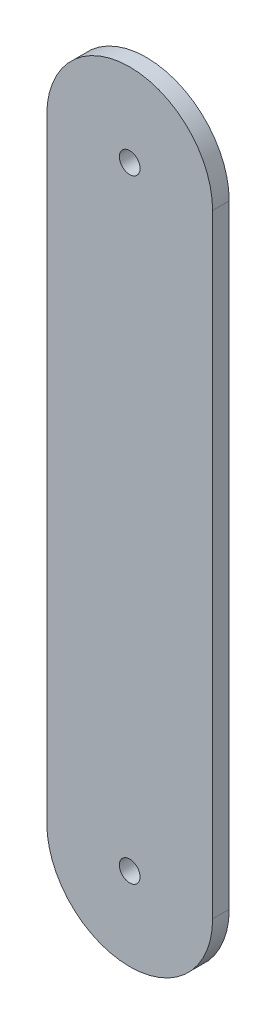
ISO-10303-21;
HEADER;
FILE_DESCRIPTION(('STEP AP214'),'2;1');
FILE_NAME('part.step','',(''),(''),'','','');
FILE_SCHEMA(('AUTOMOTIVE_DESIGN { 1 0 10303 214 1 1 1 1 }'));
ENDSEC;
DATA;
#1=APPLICATION_CONTEXT('core data for automotive mechanical design processes');
#2=APPLICATION_PROTOCOL_DEFINITION('international standard','automotive_design',2000,#1);
#3=PRODUCT_CONTEXT('',#1,'mechanical');
#4=PRODUCT('Part','Part','',(#3));
#5=PRODUCT_RELATED_PRODUCT_CATEGORY('part','',(#4));
#6=PRODUCT_DEFINITION_FORMATION('','',#4);
#7=PRODUCT_DEFINITION_CONTEXT('part definition',#1,'design');
#8=PRODUCT_DEFINITION('design','',#6,#7);
#9=PRODUCT_DEFINITION_SHAPE('','',#8);
#10=(LENGTH_UNIT() NAMED_UNIT(*) SI_UNIT(.MILLI.,.METRE.));
#11=(NAMED_UNIT(*) PLANE_ANGLE_UNIT() SI_UNIT($,.RADIAN.));
#12=(NAMED_UNIT(*) SI_UNIT($,.STERADIAN.) SOLID_ANGLE_UNIT());
#13=UNCERTAINTY_MEASURE_WITH_UNIT(LENGTH_MEASURE(1.E-05),#10,'distance_accuracy_value','');
#14=(GEOMETRIC_REPRESENTATION_CONTEXT(3) GLOBAL_UNCERTAINTY_ASSIGNED_CONTEXT((#13)) GLOBAL_UNIT_ASSIGNED_CONTEXT((#10,
#11,#12)) REPRESENTATION_CONTEXT('',''));
#15=CARTESIAN_POINT('',(0.,0.,0.));
#16=DIRECTION('',(0.,0.,1.));
#17=DIRECTION('',(1.,0.,0.));
#18=AXIS2_PLACEMENT_3D('',#15,#16,#17);
#19=CARTESIAN_POINT('',(-18.6833790479199,42.2568238213399,2.));
#20=DIRECTION('',(0.,0.,1.));
#21=DIRECTION('',(1.,0.,0.));
#22=AXIS2_PLACEMENT_3D('',#19,#20,#21);
#23=PLANE('',#22);
#24=CARTESIAN_POINT('',(-18.6833790479199,42.2568238213399,2.));
#25=DIRECTION('',(0.,0.,1.));
#26=DIRECTION('',(1.,0.,0.));
#27=AXIS2_PLACEMENT_3D('',#24,#25,#26);
#28=CIRCLE('',#27,1.25);
#29=CARTESIAN_POINT('',(-17.4333790479199,42.2568238213399,2.));
#30=VERTEX_POINT('',#29);
#31=EDGE_CURVE('E99',#30,#30,#28,.T.);
#32=ORIENTED_EDGE('',*,*,#31,.F.);
#33=EDGE_LOOP('',(#32));
#34=FACE_BOUND('',#33,.T.);
#35=CARTESIAN_POINT('',(-18.6833790479199,42.2568238213399,2.));
#36=DIRECTION('',(0.,0.,1.));
#37=DIRECTION('',(1.,0.,0.));
#38=AXIS2_PLACEMENT_3D('',#35,#36,#37);
#39=CIRCLE('',#38,10.);
#40=CARTESIAN_POINT('',(-8.68337904791993,42.2568238213399,2.));
#41=VERTEX_POINT('',#40);
#42=CARTESIAN_POINT('',(-28.6833790479199,42.2568238213399,2.));
#43=VERTEX_POINT('',#42);
#44=EDGE_CURVE('E84',#41,#43,#39,.T.);
#45=ORIENTED_EDGE('',*,*,#44,.T.);
#46=DIRECTION('',(0.,-1.,0.));
#47=VECTOR('',#46,1.);
#48=CARTESIAN_POINT('',(-28.6833790479199,42.2568238213399,2.));
#49=LINE('',#48,#47);
#50=CARTESIAN_POINT('',(-28.6833790479199,-31.7431761786601,2.));
#51=VERTEX_POINT('',#50);
#52=EDGE_CURVE('E79',#43,#51,#49,.T.);
#53=ORIENTED_EDGE('',*,*,#52,.T.);
#54=CARTESIAN_POINT('',(-18.6833790479199,-31.7431761786601,2.));
#55=DIRECTION('',(0.,0.,1.));
#56=DIRECTION('',(-1.,0.,0.));
#57=AXIS2_PLACEMENT_3D('',#54,#55,#56);
#58=CIRCLE('',#57,10.);
#59=CARTESIAN_POINT('',(-8.68337904791992,-31.7431761786601,2.));
#60=VERTEX_POINT('',#59);
#61=EDGE_CURVE('E82',#51,#60,#58,.T.);
#62=ORIENTED_EDGE('',*,*,#61,.T.);
#63=DIRECTION('',(0.,1.,0.));
#64=VECTOR('',#63,1.);
#65=CARTESIAN_POINT('',(-8.68337904791993,42.2568238213399,2.));
#66=LINE('',#65,#64);
#67=EDGE_CURVE('E49',#60,#41,#66,.T.);
#68=ORIENTED_EDGE('',*,*,#67,.T.);
#69=EDGE_LOOP('',(#45,#53,#62,#68));
#70=FACE_BOUND('',#69,.T.);
#71=CARTESIAN_POINT('',(-18.6833790479199,-31.7431761786601,2.));
#72=DIRECTION('',(0.,0.,1.));
#73=DIRECTION('',(1.,0.,0.));
#74=AXIS2_PLACEMENT_3D('',#71,#72,#73);
#75=CIRCLE('',#74,1.25);
#76=CARTESIAN_POINT('',(-17.4333790479199,-31.7431761786601,2.));
#77=VERTEX_POINT('',#76);
#78=EDGE_CURVE('E114',#77,#77,#75,.T.);
#79=ORIENTED_EDGE('',*,*,#78,.F.);
#80=EDGE_LOOP('',(#79));
#81=FACE_BOUND('',#80,.T.);
#82=ADVANCED_FACE('F32',(#34,#70,#81),#23,.T.);
#83=CARTESIAN_POINT('',(-18.6833790479199,42.2568238213399,0.));
#84=DIRECTION('',(0.,0.,1.));
#85=DIRECTION('',(1.,0.,0.));
#86=AXIS2_PLACEMENT_3D('',#83,#84,#85);
#87=PLANE('',#86);
#88=CARTESIAN_POINT('',(-18.6833790479199,42.2568238213399,0.));
#89=DIRECTION('',(0.,0.,1.));
#90=DIRECTION('',(1.,0.,0.));
#91=AXIS2_PLACEMENT_3D('',#88,#89,#90);
#92=CIRCLE('',#91,10.);
#93=CARTESIAN_POINT('',(-8.68337904791993,42.2568238213399,0.));
#94=VERTEX_POINT('',#93);
#95=CARTESIAN_POINT('',(-28.6833790479199,42.2568238213399,0.));
#96=VERTEX_POINT('',#95);
#97=EDGE_CURVE('E96',#94,#96,#92,.T.);
#98=ORIENTED_EDGE('',*,*,#97,.F.);
#99=DIRECTION('',(0.,1.,0.));
#100=VECTOR('',#99,1.);
#101=CARTESIAN_POINT('',(-8.68337904791993,42.2568238213399,0.));
#102=LINE('',#101,#100);
#103=CARTESIAN_POINT('',(-8.68337904791992,-31.7431761786601,0.));
#104=VERTEX_POINT('',#103);
#105=EDGE_CURVE('E72',#104,#94,#102,.T.);
#106=ORIENTED_EDGE('',*,*,#105,.F.);
#107=CARTESIAN_POINT('',(-18.6833790479199,-31.7431761786601,0.));
#108=DIRECTION('',(0.,0.,1.));
#109=DIRECTION('',(-1.,0.,0.));
#110=AXIS2_PLACEMENT_3D('',#107,#108,#109);
#111=CIRCLE('',#110,10.);
#112=CARTESIAN_POINT('',(-28.6833790479199,-31.7431761786601,0.));
#113=VERTEX_POINT('',#112);
#114=EDGE_CURVE('E66',#113,#104,#111,.T.);
#115=ORIENTED_EDGE('',*,*,#114,.F.);
#116=DIRECTION('',(0.,-1.,0.));
#117=VECTOR('',#116,1.);
#118=CARTESIAN_POINT('',(-28.6833790479199,42.2568238213399,0.));
#119=LINE('',#118,#117);
#120=EDGE_CURVE('E88',#96,#113,#119,.T.);
#121=ORIENTED_EDGE('',*,*,#120,.F.);
#122=EDGE_LOOP('',(#98,#106,#115,#121));
#123=FACE_BOUND('',#122,.T.);
#124=CARTESIAN_POINT('',(-18.6833790479199,42.2568238213399,0.));
#125=DIRECTION('',(0.,0.,1.));
#126=DIRECTION('',(1.,0.,0.));
#127=AXIS2_PLACEMENT_3D('',#124,#125,#126);
#128=CIRCLE('',#127,1.25);
#129=CARTESIAN_POINT('',(-17.4333790479199,42.2568238213399,0.));
#130=VERTEX_POINT('',#129);
#131=EDGE_CURVE('E111',#130,#130,#128,.T.);
#132=ORIENTED_EDGE('',*,*,#131,.T.);
#133=EDGE_LOOP('',(#132));
#134=FACE_BOUND('',#133,.T.);
#135=CARTESIAN_POINT('',(-18.6833790479199,-31.7431761786601,0.));
#136=DIRECTION('',(0.,0.,1.));
#137=DIRECTION('',(1.,0.,0.));
#138=AXIS2_PLACEMENT_3D('',#135,#136,#137);
#139=CIRCLE('',#138,1.25);
#140=CARTESIAN_POINT('',(-17.4333790479199,-31.7431761786601,0.));
#141=VERTEX_POINT('',#140);
#142=EDGE_CURVE('E117',#141,#141,#139,.T.);
#143=ORIENTED_EDGE('',*,*,#142,.T.);
#144=EDGE_LOOP('',(#143));
#145=FACE_BOUND('',#144,.T.);
#146=ADVANCED_FACE('F107',(#123,#134,#145),#87,.F.);
#147=CARTESIAN_POINT('',(-18.6833790479199,42.2568238213399,2.));
#148=DIRECTION('',(0.,0.,-1.));
#149=DIRECTION('',(-1.,0.,0.));
#150=AXIS2_PLACEMENT_3D('',#147,#148,#149);
#151=CYLINDRICAL_SURFACE('',#150,10.);
#152=ORIENTED_EDGE('',*,*,#97,.T.);
#153=DIRECTION('',(0.,0.,-1.));
#154=VECTOR('',#153,1.);
#155=CARTESIAN_POINT('',(-28.6833790479199,42.2568238213399,2.));
#156=LINE('',#155,#154);
#157=EDGE_CURVE('E11',#43,#96,#156,.T.);
#158=ORIENTED_EDGE('',*,*,#157,.F.);
#159=ORIENTED_EDGE('',*,*,#44,.F.);
#160=DIRECTION('',(0.,0.,-1.));
#161=VECTOR('',#160,1.);
#162=CARTESIAN_POINT('',(-8.68337904791993,42.2568238213399,2.));
#163=LINE('',#162,#161);
#164=EDGE_CURVE('E92',#41,#94,#163,.T.);
#165=ORIENTED_EDGE('',*,*,#164,.T.);
#166=EDGE_LOOP('',(#152,#158,#159,#165));
#167=FACE_BOUND('',#166,.T.);
#168=ADVANCED_FACE('F34',(#167),#151,.T.);
#169=CARTESIAN_POINT('',(-28.6833790479199,42.2568238213399,2.));
#170=DIRECTION('',(1.,0.,0.));
#171=DIRECTION('',(0.,1.,0.));
#172=AXIS2_PLACEMENT_3D('',#169,#170,#171);
#173=PLANE('',#172);
#174=ORIENTED_EDGE('',*,*,#120,.T.);
#175=DIRECTION('',(0.,0.,-1.));
#176=VECTOR('',#175,1.);
#177=CARTESIAN_POINT('',(-28.6833790479199,-31.7431761786601,2.));
#178=LINE('',#177,#176);
#179=EDGE_CURVE('E41',#51,#113,#178,.T.);
#180=ORIENTED_EDGE('',*,*,#179,.F.);
#181=ORIENTED_EDGE('',*,*,#52,.F.);
#182=ORIENTED_EDGE('',*,*,#157,.T.);
#183=EDGE_LOOP('',(#174,#180,#181,#182));
#184=FACE_BOUND('',#183,.T.);
#185=ADVANCED_FACE('F87',(#184),#173,.F.);
#186=CARTESIAN_POINT('',(-18.6833790479199,-31.7431761786601,2.));
#187=DIRECTION('',(0.,0.,-1.));
#188=DIRECTION('',(-1.,0.,0.));
#189=AXIS2_PLACEMENT_3D('',#186,#187,#188);
#190=CYLINDRICAL_SURFACE('',#189,10.);
#191=ORIENTED_EDGE('',*,*,#114,.T.);
#192=DIRECTION('',(0.,0.,-1.));
#193=VECTOR('',#192,1.);
#194=CARTESIAN_POINT('',(-8.68337904791992,-31.7431761786601,2.));
#195=LINE('',#194,#193);
#196=EDGE_CURVE('E89',#60,#104,#195,.T.);
#197=ORIENTED_EDGE('',*,*,#196,.F.);
#198=ORIENTED_EDGE('',*,*,#61,.F.);
#199=ORIENTED_EDGE('',*,*,#179,.T.);
#200=EDGE_LOOP('',(#191,#197,#198,#199));
#201=FACE_BOUND('',#200,.T.);
#202=ADVANCED_FACE('F90',(#201),#190,.T.);
#203=CARTESIAN_POINT('',(-8.68337904791993,42.2568238213399,2.));
#204=DIRECTION('',(-1.,0.,0.));
#205=DIRECTION('',(0.,-1.,0.));
#206=AXIS2_PLACEMENT_3D('',#203,#204,#205);
#207=PLANE('',#206);
#208=ORIENTED_EDGE('',*,*,#105,.T.);
#209=ORIENTED_EDGE('',*,*,#164,.F.);
#210=ORIENTED_EDGE('',*,*,#67,.F.);
#211=ORIENTED_EDGE('',*,*,#196,.T.);
#212=EDGE_LOOP('',(#208,#209,#210,#211));
#213=FACE_BOUND('',#212,.T.);
#214=ADVANCED_FACE('F104',(#213),#207,.F.);
#215=CARTESIAN_POINT('',(-18.6833790479199,42.2568238213399,2.));
#216=DIRECTION('',(0.,0.,-1.));
#217=DIRECTION('',(-1.,0.,0.));
#218=AXIS2_PLACEMENT_3D('',#215,#216,#217);
#219=CYLINDRICAL_SURFACE('',#218,1.25);
#220=ORIENTED_EDGE('',*,*,#31,.T.);
#221=EDGE_LOOP('',(#220));
#222=FACE_BOUND('',#221,.T.);
#223=ORIENTED_EDGE('',*,*,#131,.F.);
#224=EDGE_LOOP('',(#223));
#225=FACE_BOUND('',#224,.T.);
#226=ADVANCED_FACE('F134',(#222,#225),#219,.F.);
#227=CARTESIAN_POINT('',(-18.6833790479199,-31.7431761786601,2.));
#228=DIRECTION('',(0.,0.,-1.));
#229=DIRECTION('',(-1.,0.,0.));
#230=AXIS2_PLACEMENT_3D('',#227,#228,#229);
#231=CYLINDRICAL_SURFACE('',#230,1.25);
#232=ORIENTED_EDGE('',*,*,#78,.T.);
#233=EDGE_LOOP('',(#232));
#234=FACE_BOUND('',#233,.T.);
#235=ORIENTED_EDGE('',*,*,#142,.F.);
#236=EDGE_LOOP('',(#235));
#237=FACE_BOUND('',#236,.T.);
#238=ADVANCED_FACE('F123',(#234,#237),#231,.F.);
#239=CLOSED_SHELL('',(#82,#146,#168,#185,#202,#214,#226,#238));
#240=MANIFOLD_SOLID_BREP('B2',#239);
#241=ADVANCED_BREP_SHAPE_REPRESENTATION('',(#18,#240),#14);
#242=SHAPE_DEFINITION_REPRESENTATION(#9,#241);
ENDSEC;
END-ISO-10303-21;
